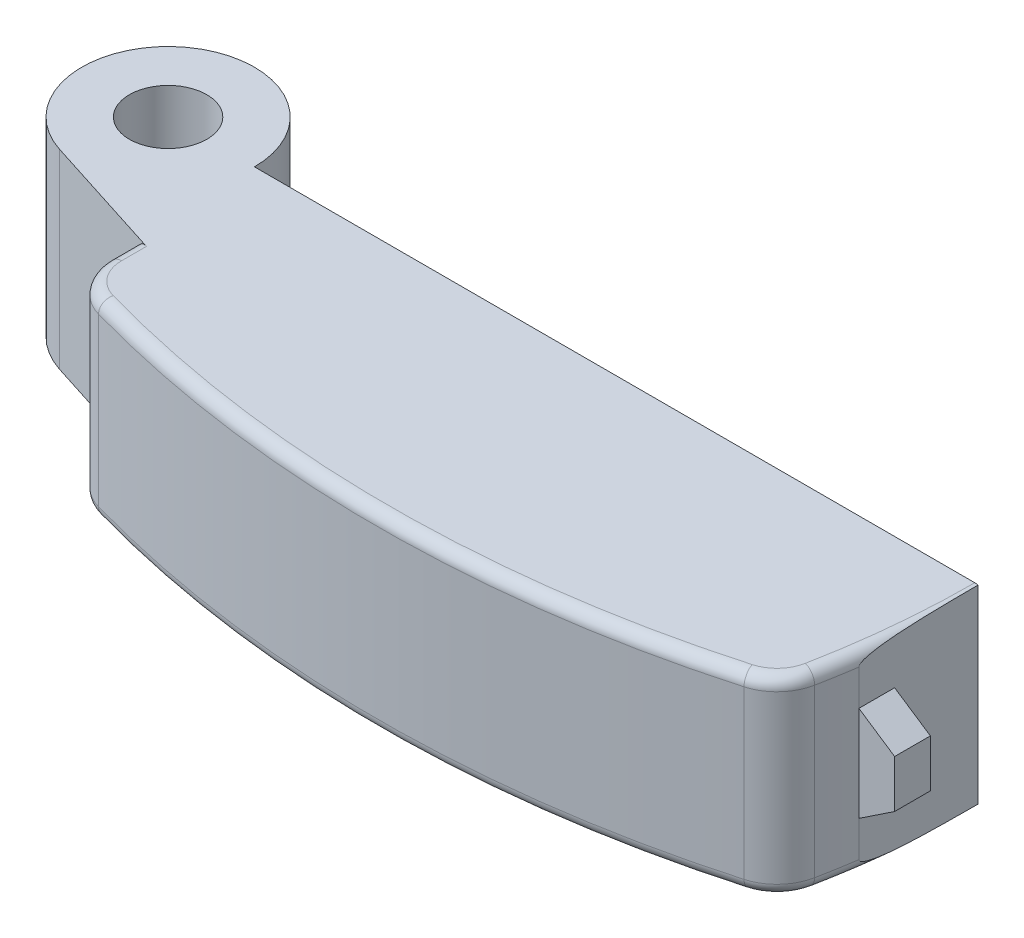
ISO-10303-21;
HEADER;
FILE_DESCRIPTION(('STEP AP214'),'2;1');
FILE_NAME('part.step','',(''),(''),'','','');
FILE_SCHEMA(('AUTOMOTIVE_DESIGN { 1 0 10303 214 1 1 1 1 }'));
ENDSEC;
DATA;
#1=APPLICATION_CONTEXT('core data for automotive mechanical design processes');
#2=APPLICATION_PROTOCOL_DEFINITION('international standard','automotive_design',2000,#1);
#3=PRODUCT_CONTEXT('',#1,'mechanical');
#4=PRODUCT('Part','Part','',(#3));
#5=PRODUCT_RELATED_PRODUCT_CATEGORY('part','',(#4));
#6=PRODUCT_DEFINITION_FORMATION('','',#4);
#7=PRODUCT_DEFINITION_CONTEXT('part definition',#1,'design');
#8=PRODUCT_DEFINITION('design','',#6,#7);
#9=PRODUCT_DEFINITION_SHAPE('','',#8);
#10=(LENGTH_UNIT() NAMED_UNIT(*) SI_UNIT(.MILLI.,.METRE.));
#11=(NAMED_UNIT(*) PLANE_ANGLE_UNIT() SI_UNIT($,.RADIAN.));
#12=(NAMED_UNIT(*) SI_UNIT($,.STERADIAN.) SOLID_ANGLE_UNIT());
#13=UNCERTAINTY_MEASURE_WITH_UNIT(LENGTH_MEASURE(1.E-05),#10,'distance_accuracy_value','');
#14=(GEOMETRIC_REPRESENTATION_CONTEXT(3) GLOBAL_UNCERTAINTY_ASSIGNED_CONTEXT((#13)) GLOBAL_UNIT_ASSIGNED_CONTEXT((#10,
#11,#12)) REPRESENTATION_CONTEXT('',''));
#15=CARTESIAN_POINT('',(0.,0.,0.));
#16=DIRECTION('',(0.,0.,1.));
#17=DIRECTION('',(1.,0.,0.));
#18=AXIS2_PLACEMENT_3D('',#15,#16,#17);
#19=CARTESIAN_POINT('',(34.,-4.,0.));
#20=DIRECTION('',(1.,0.,0.));
#21=DIRECTION('',(0.,0.,-1.));
#22=AXIS2_PLACEMENT_3D('',#19,#20,#21);
#23=PLANE('',#22);
#24=DIRECTION('',(0.,1.,0.));
#25=VECTOR('',#24,1.);
#26=CARTESIAN_POINT('',(34.,-4.,0.));
#27=LINE('',#26,#25);
#28=CARTESIAN_POINT('',(34.,-3.98162047990345,0.));
#29=VERTEX_POINT('',#28);
#30=CARTESIAN_POINT('',(34.,3.98162047990345,0.));
#31=VERTEX_POINT('',#30);
#32=EDGE_CURVE('E276',#29,#31,#27,.T.);
#33=ORIENTED_EDGE('',*,*,#32,.T.);
#34=CARTESIAN_POINT('',(34.,3.98162047990345,0.));
#35=CARTESIAN_POINT('',(34.,3.98159919285578,0.166663353283519));
#36=CARTESIAN_POINT('',(34.,3.9812782589749,0.333327294181278));
#37=CARTESIAN_POINT('',(34.,3.97988188118695,0.666662112135818));
#38=CARTESIAN_POINT('',(34.,3.97880639104146,0.833332988991726));
#39=CARTESIAN_POINT('',(34.,3.97524749303556,1.2209193138533));
#40=CARTESIAN_POINT('',(34.,3.97241974710555,1.44183183546992));
#41=CARTESIAN_POINT('',(34.,3.96436598597591,1.88361503266656));
#42=CARTESIAN_POINT('',(34.,3.95914001129464,2.1044857088905));
#43=CARTESIAN_POINT('',(34.,3.94722392938513,2.47360634591054));
#44=CARTESIAN_POINT('',(34.,3.9415779501098,2.62188919436799));
#45=CARTESIAN_POINT('',(34.,3.92790773499044,2.91834424872081));
#46=CARTESIAN_POINT('',(34.,3.91988361396798,3.06651645961182));
#47=CARTESIAN_POINT('',(34.,3.90361515757844,3.31437209200094));
#48=CARTESIAN_POINT('',(34.,3.89629540492433,3.41411552051021));
#49=CARTESIAN_POINT('',(34.,3.87964168815936,3.61343592334133));
#50=CARTESIAN_POINT('',(34.,3.87030779021255,3.71301290302272));
#51=CARTESIAN_POINT('',(34.,3.852359969864,3.87973069369845));
#52=CARTESIAN_POINT('',(34.,3.84448883990097,3.9469503175671));
#53=CARTESIAN_POINT('',(34.,3.82712410299428,4.08117783108778));
#54=CARTESIAN_POINT('',(34.,3.81763054000707,4.14818572642606));
#55=CARTESIAN_POINT('',(34.,3.79272184936317,4.30591743528455));
#56=CARTESIAN_POINT('',(34.,3.77640485055772,4.39650752111803));
#57=CARTESIAN_POINT('',(34.,3.74332824174571,4.54786051817009));
#58=CARTESIAN_POINT('',(34.,3.72834192907911,4.60899243665312));
#59=CARTESIAN_POINT('',(34.,3.69849031910501,4.7109467376168));
#60=CARTESIAN_POINT('',(34.,3.68503869387045,4.7521691463843));
#61=CARTESIAN_POINT('',(34.,3.65847672338858,4.82073701669557));
#62=CARTESIAN_POINT('',(34.,3.6465033543779,4.84849491212171));
#63=CARTESIAN_POINT('',(34.,3.62528803249557,4.88959316091038));
#64=CARTESIAN_POINT('',(34.,3.61738026572595,4.9036148604728));
#65=CARTESIAN_POINT('',(34.,3.60001706070478,4.93065693305494));
#66=CARTESIAN_POINT('',(34.,3.59056838390864,4.9436813308398));
#67=CARTESIAN_POINT('',(34.,3.57563952165258,4.96042341024651));
#68=CARTESIAN_POINT('',(34.,3.57117781540687,4.96503801058248));
#69=CARTESIAN_POINT('',(34.,3.56176479223758,4.97377095715126));
#70=CARTESIAN_POINT('',(34.,3.55681245000462,4.97788822248747));
#71=CARTESIAN_POINT('',(34.,3.54626129849113,4.98543771114093));
#72=CARTESIAN_POINT('',(34.,3.54065251481596,4.98885637176807));
#73=CARTESIAN_POINT('',(34.,3.528877015265,4.99449638178223));
#74=CARTESIAN_POINT('',(34.,3.522714712715,4.99672636377805));
#75=CARTESIAN_POINT('',(34.,3.51369951830024,4.9987596278393));
#76=CARTESIAN_POINT('',(34.,3.51098967279807,4.99922065264334));
#77=CARTESIAN_POINT('',(34.,3.50552098802409,4.9998424277503));
#78=CARTESIAN_POINT('',(34.,3.50276196205584,5.00000152519938));
#79=CARTESIAN_POINT('',(34.,3.50000000000018,5.0000000000008));
#80=B_SPLINE_CURVE_WITH_KNOTS('',3,(#34,#35,#36,#37,#38,#39,#40,#41,#42,#43,#44,#45,#46,#47,#48,
#49,#50,#51,#52,#53,#54,#55,#56,#57,#58,#59,#60,#61,#62,#63,#64,#65,#66,#67,#68,#69,#70,#71,#72,
#73,#74,#75,#76,#77,#78,#79),.UNSPECIFIED.,.F.,.F.,(4,2,2,2,2,2,2,2,2,2,2,2,2,2,2,2,2,2,2,2,2,2,
4),(0.,0.499990678696892,1.00001199897152,1.66279683154769,2.32557046670793,2.77072938462129,
3.2158668128472,3.51588769623864,3.81589872553636,4.01891875475482,4.22193328443876,
4.4979272478123,4.68660242743181,4.81656238283177,4.90705466279417,4.95530314075089,
5.00334533733403,5.02257492930979,5.04184558986957,5.06146076057049,5.08093146809262,
5.08916262656677,5.09743871668332),.UNSPECIFIED.);
#81=CARTESIAN_POINT('',(34.,3.5,5.));
#82=VERTEX_POINT('',#81);
#83=EDGE_CURVE('E337',#31,#82,#80,.T.);
#84=ORIENTED_EDGE('',*,*,#83,.T.);
#85=DIRECTION('',(0.,1.,0.));
#86=VECTOR('',#85,1.);
#87=CARTESIAN_POINT('',(34.,-4.,5.));
#88=LINE('',#87,#86);
#89=CARTESIAN_POINT('',(34.,2.,5.));
#90=VERTEX_POINT('',#89);
#91=EDGE_CURVE('E285',#90,#82,#88,.T.);
#92=ORIENTED_EDGE('',*,*,#91,.F.);
#93=DIRECTION('',(0.,0.,1.));
#94=VECTOR('',#93,1.);
#95=CARTESIAN_POINT('',(34.,2.,3.5));
#96=LINE('',#95,#94);
#97=CARTESIAN_POINT('',(34.,2.,3.5));
#98=VERTEX_POINT('',#97);
#99=EDGE_CURVE('E254',#98,#90,#96,.T.);
#100=ORIENTED_EDGE('',*,*,#99,.F.);
#101=DIRECTION('',(0.,-1.,0.));
#102=VECTOR('',#101,1.);
#103=CARTESIAN_POINT('',(34.,2.,3.5));
#104=LINE('',#103,#102);
#105=CARTESIAN_POINT('',(34.,-2.,3.5));
#106=VERTEX_POINT('',#105);
#107=EDGE_CURVE('E228',#98,#106,#104,.T.);
#108=ORIENTED_EDGE('',*,*,#107,.T.);
#109=DIRECTION('',(0.,0.,1.));
#110=VECTOR('',#109,1.);
#111=CARTESIAN_POINT('',(34.,-2.,3.5));
#112=LINE('',#111,#110);
#113=CARTESIAN_POINT('',(34.,-2.,5.));
#114=VERTEX_POINT('',#113);
#115=EDGE_CURVE('E241',#106,#114,#112,.T.);
#116=ORIENTED_EDGE('',*,*,#115,.T.);
#117=CARTESIAN_POINT('',(34.,-3.5,5.));
#118=VERTEX_POINT('',#117);
#119=EDGE_CURVE('E282',#118,#114,#88,.T.);
#120=ORIENTED_EDGE('',*,*,#119,.F.);
#121=CARTESIAN_POINT('',(34.,-3.5,5.));
#122=CARTESIAN_POINT('',(34.,-3.50462170859831,5.00001441578487));
#123=CARTESIAN_POINT('',(34.,-3.50922301130585,4.99956020687158));
#124=CARTESIAN_POINT('',(34.,-3.51821116965306,4.99785256927715));
#125=CARTESIAN_POINT('',(34.,-3.52260012514395,4.99661041346052));
#126=CARTESIAN_POINT('',(34.,-3.53238372731554,4.99299290089972));
#127=CARTESIAN_POINT('',(34.,-3.53769278067331,4.99039126685224));
#128=CARTESIAN_POINT('',(34.,-3.54785693125141,4.98438000424587));
#129=CARTESIAN_POINT('',(34.,-3.55270896754212,4.98096540303662));
#130=CARTESIAN_POINT('',(34.,-3.56569920393553,4.97061828430371));
#131=CARTESIAN_POINT('',(34.,-3.57333698742003,4.96306726385114));
#132=CARTESIAN_POINT('',(34.,-3.58752317700618,4.94702965383022));
#133=CARTESIAN_POINT('',(34.,-3.59406922645835,4.93854110445036));
#134=CARTESIAN_POINT('',(34.,-3.61030400808269,4.91540419858887));
#135=CARTESIAN_POINT('',(34.,-3.61932227716577,4.90029094106801));
#136=CARTESIAN_POINT('',(34.,-3.63599364258111,4.86931831460478));
#137=CARTESIAN_POINT('',(34.,-3.64364323179573,4.85345715687245));
#138=CARTESIAN_POINT('',(34.,-3.65800488289259,4.82120376344424));
#139=CARTESIAN_POINT('',(34.,-3.66471097925828,4.80480889084885));
#140=CARTESIAN_POINT('',(34.,-3.67736826020147,4.77175970887534));
#141=CARTESIAN_POINT('',(34.,-3.6833204123233,4.75510576344547));
#142=CARTESIAN_POINT('',(34.,-3.70214339592804,4.69946087457146));
#143=CARTESIAN_POINT('',(34.,-3.71375805855376,4.66004670133561));
#144=CARTESIAN_POINT('',(34.,-3.73502133605224,4.58068544266667));
#145=CARTESIAN_POINT('',(34.,-3.74466851399785,4.54073799028498));
#146=CARTESIAN_POINT('',(34.,-3.7715546716792,4.42024978207699));
#147=CARTESIAN_POINT('',(34.,-3.78668516945335,4.33924167886029));
#148=CARTESIAN_POINT('',(34.,-3.81359709252584,4.17653346358184));
#149=CARTESIAN_POINT('',(34.,-3.82537138752914,4.09483225240811));
#150=CARTESIAN_POINT('',(34.,-3.84650665474788,3.93124531059158));
#151=CARTESIAN_POINT('',(34.,-3.85587121287893,3.84936003918776));
#152=CARTESIAN_POINT('',(34.,-3.88087876741824,3.60786093452974));
#153=CARTESIAN_POINT('',(34.,-3.89408026755351,3.44799906108821));
#154=CARTESIAN_POINT('',(34.,-3.91632800111269,3.12797672361124));
#155=CARTESIAN_POINT('',(34.,-3.92537337180561,2.96781620450439));
#156=CARTESIAN_POINT('',(34.,-3.94061456564004,2.64711868932304));
#157=CARTESIAN_POINT('',(34.,-3.94680602895098,2.48658149133196));
#158=CARTESIAN_POINT('',(34.,-3.95717067630038,2.16545957623382));
#159=CARTESIAN_POINT('',(34.,-3.96134403688193,2.00487486451345));
#160=CARTESIAN_POINT('',(34.,-3.9680972943462,1.6904148039248));
#161=CARTESIAN_POINT('',(34.,-3.97073670889247,1.5365406825591));
#162=CARTESIAN_POINT('',(34.,-3.97503111362743,1.22877499554967));
#163=CARTESIAN_POINT('',(34.,-3.97668607619645,1.07488342953767));
#164=CARTESIAN_POINT('',(34.,-3.97924452328905,0.767490952157286));
#165=CARTESIAN_POINT('',(34.,-3.98014993324856,0.61399005598307));
#166=CARTESIAN_POINT('',(34.,-3.98132991318917,0.306992628334647));
#167=CARTESIAN_POINT('',(34.,-3.98160451138959,0.153496096972381));
#168=CARTESIAN_POINT('',(34.,-3.98162047990346,0.));
#169=B_SPLINE_CURVE_WITH_KNOTS('',3,(#121,#122,#123,#124,#125,#126,#127,#128,#129,#130,#131,
#132,#133,#134,#135,#136,#137,#138,#139,#140,#141,#142,#143,#144,#145,#146,#147,#148,#149,#150,
#151,#152,#153,#154,#155,#156,#157,#158,#159,#160,#161,#162,#163,#164,#165,#166,#167,#168),
.UNSPECIFIED.,.F.,.F.,(4,2,2,2,2,2,2,2,2,2,2,2,2,2,2,2,2,2,2,2,2,2,2,4),(0.,0.0138100444294082,
0.027426837314904,0.0450633627516521,0.0628106694330619,0.0948505858062899,0.126958793573787,
0.179619431310576,0.232413132693816,0.285526926882936,0.338571853740002,0.461743268273278,
0.58500431984306,0.832083700583452,1.07968415744165,1.32691400246769,1.80803205477512,
2.28924993268835,2.77120053627508,3.25310897132358,3.71479508684799,4.17649415477853,
4.63700350655861,5.09749225708178),.UNSPECIFIED.);
#170=EDGE_CURVE('E331',#118,#29,#169,.T.);
#171=ORIENTED_EDGE('',*,*,#170,.T.);
#172=EDGE_LOOP('',(#33,#84,#92,#100,#108,#116,#120,#171));
#173=FACE_BOUND('',#172,.T.);
#174=ADVANCED_FACE('F32',(#173),#23,.T.);
#175=CARTESIAN_POINT('',(0.,-4.,0.));
#176=DIRECTION('',(0.,1.,0.));
#177=DIRECTION('',(0.,0.,1.));
#178=AXIS2_PLACEMENT_3D('',#175,#176,#177);
#179=CYLINDRICAL_SURFACE('',#178,34.3656805548792);
#180=ORIENTED_EDGE('',*,*,#91,.T.);
#181=CARTESIAN_POINT('',(0.,3.5,0.));
#182=DIRECTION('',(0.,-1.,0.));
#183=DIRECTION('',(0.,0.,-1.));
#184=AXIS2_PLACEMENT_3D('',#181,#182,#183);
#185=CIRCLE('',#184,34.3656805548792);
#186=CARTESIAN_POINT('',(33.7284498627736,3.5,6.58723537262523));
#187=VERTEX_POINT('',#186);
#188=EDGE_CURVE('E437',#82,#187,#185,.T.);
#189=ORIENTED_EDGE('',*,*,#188,.T.);
#190=DIRECTION('',(0.,1.,0.));
#191=VECTOR('',#190,1.);
#192=CARTESIAN_POINT('',(33.7284498627736,-4.,6.58723537262523));
#193=LINE('',#192,#191);
#194=CARTESIAN_POINT('',(33.7284498627736,-3.5,6.58723537262523));
#195=VERTEX_POINT('',#194);
#196=EDGE_CURVE('E286',#195,#187,#193,.T.);
#197=ORIENTED_EDGE('',*,*,#196,.F.);
#198=CARTESIAN_POINT('',(0.,-3.5,0.));
#199=DIRECTION('',(0.,-1.,0.));
#200=DIRECTION('',(0.,0.,-1.));
#201=AXIS2_PLACEMENT_3D('',#198,#199,#200);
#202=CIRCLE('',#201,34.3656805548792);
#203=EDGE_CURVE('E438',#195,#118,#202,.F.);
#204=ORIENTED_EDGE('',*,*,#203,.T.);
#205=ORIENTED_EDGE('',*,*,#119,.T.);
#206=DIRECTION('',(0.,-1.,0.));
#207=VECTOR('',#206,1.);
#208=CARTESIAN_POINT('',(34.,2.,5.));
#209=LINE('',#208,#207);
#210=EDGE_CURVE('E242',#90,#114,#209,.T.);
#211=ORIENTED_EDGE('',*,*,#210,.F.);
#212=EDGE_LOOP('',(#180,#189,#197,#204,#205,#211));
#213=FACE_BOUND('',#212,.T.);
#214=ADVANCED_FACE('F347',(#213),#179,.T.);
#215=CARTESIAN_POINT('',(31.7655351572777,-4.,6.20387410834845));
#216=DIRECTION('',(0.,1.,0.));
#217=DIRECTION('',(0.,0.,1.));
#218=AXIS2_PLACEMENT_3D('',#215,#216,#217);
#219=CYLINDRICAL_SURFACE('',#218,2.);
#220=ORIENTED_EDGE('',*,*,#196,.T.);
#221=CARTESIAN_POINT('',(31.7655351572777,3.5,6.20387410834845));
#222=DIRECTION('',(0.,-1.,0.));
#223=DIRECTION('',(0.,0.,-1.));
#224=AXIS2_PLACEMENT_3D('',#221,#222,#223);
#225=CIRCLE('',#224,2.);
#226=CARTESIAN_POINT('',(32.3075254730544,3.5,8.12903552952963));
#227=VERTEX_POINT('',#226);
#228=EDGE_CURVE('E434',#187,#227,#225,.T.);
#229=ORIENTED_EDGE('',*,*,#228,.T.);
#230=DIRECTION('',(0.,1.,0.));
#231=VECTOR('',#230,1.);
#232=CARTESIAN_POINT('',(32.3075254730544,-4.,8.12903552952963));
#233=LINE('',#232,#231);
#234=CARTESIAN_POINT('',(32.3075254730544,-3.5,8.12903552952963));
#235=VERTEX_POINT('',#234);
#236=EDGE_CURVE('E289',#235,#227,#233,.T.);
#237=ORIENTED_EDGE('',*,*,#236,.F.);
#238=CARTESIAN_POINT('',(31.7655351572777,-3.5,6.20387410834845));
#239=DIRECTION('',(0.,-1.,0.));
#240=DIRECTION('',(0.,0.,-1.));
#241=AXIS2_PLACEMENT_3D('',#238,#239,#240);
#242=CIRCLE('',#241,2.);
#243=EDGE_CURVE('E396',#235,#195,#242,.F.);
#244=ORIENTED_EDGE('',*,*,#243,.T.);
#245=EDGE_LOOP('',(#220,#229,#237,#244));
#246=FACE_BOUND('',#245,.T.);
#247=ADVANCED_FACE('F458',(#246),#219,.T.);
#248=CARTESIAN_POINT('',(18.7577675786389,-4.,-40.));
#249=DIRECTION('',(0.,1.,0.));
#250=DIRECTION('',(0.,0.,1.));
#251=AXIS2_PLACEMENT_3D('',#248,#249,#250);
#252=CYLINDRICAL_SURFACE('',#251,50.);
#253=ORIENTED_EDGE('',*,*,#236,.T.);
#254=CARTESIAN_POINT('',(18.7577675786389,3.5,-40.));
#255=DIRECTION('',(0.,-1.,0.));
#256=DIRECTION('',(0.,0.,-1.));
#257=AXIS2_PLACEMENT_3D('',#254,#255,#256);
#258=CIRCLE('',#257,50.);
#259=CARTESIAN_POINT('',(5.20800968422338,3.5,8.12903552952963));
#260=VERTEX_POINT('',#259);
#261=EDGE_CURVE('E421',#227,#260,#258,.T.);
#262=ORIENTED_EDGE('',*,*,#261,.T.);
#263=DIRECTION('',(0.,1.,0.));
#264=VECTOR('',#263,1.);
#265=CARTESIAN_POINT('',(5.20800968422338,-4.,8.12903552952963));
#266=LINE('',#265,#264);
#267=CARTESIAN_POINT('',(5.20800968422338,-3.5,8.12903552952963));
#268=VERTEX_POINT('',#267);
#269=EDGE_CURVE('E292',#268,#260,#266,.T.);
#270=ORIENTED_EDGE('',*,*,#269,.F.);
#271=CARTESIAN_POINT('',(18.7577675786389,-3.5,-40.));
#272=DIRECTION('',(0.,-1.,0.));
#273=DIRECTION('',(0.,0.,-1.));
#274=AXIS2_PLACEMENT_3D('',#271,#272,#273);
#275=CIRCLE('',#274,50.);
#276=EDGE_CURVE('E423',#268,#235,#275,.F.);
#277=ORIENTED_EDGE('',*,*,#276,.T.);
#278=EDGE_LOOP('',(#253,#262,#270,#277));
#279=FACE_BOUND('',#278,.T.);
#280=ADVANCED_FACE('F460',(#279),#252,.T.);
#281=CARTESIAN_POINT('',(5.75,-4.,6.20387410834845));
#282=DIRECTION('',(0.,1.,0.));
#283=DIRECTION('',(0.,0.,1.));
#284=AXIS2_PLACEMENT_3D('',#281,#282,#283);
#285=CYLINDRICAL_SURFACE('',#284,2.);
#286=ORIENTED_EDGE('',*,*,#269,.T.);
#287=CARTESIAN_POINT('',(5.75,3.5,6.20387410834845));
#288=DIRECTION('',(0.,-1.,0.));
#289=DIRECTION('',(0.,0.,-1.));
#290=AXIS2_PLACEMENT_3D('',#287,#288,#289);
#291=CIRCLE('',#290,2.);
#292=CARTESIAN_POINT('',(3.75,3.5,6.20387410834845));
#293=VERTEX_POINT('',#292);
#294=EDGE_CURVE('E325',#260,#293,#291,.T.);
#295=ORIENTED_EDGE('',*,*,#294,.T.);
#296=DIRECTION('',(0.,1.,0.));
#297=VECTOR('',#296,1.);
#298=CARTESIAN_POINT('',(3.75,-4.,6.20387410834845));
#299=LINE('',#298,#297);
#300=CARTESIAN_POINT('',(3.75,-3.5,6.20387410834845));
#301=VERTEX_POINT('',#300);
#302=EDGE_CURVE('E295',#301,#293,#299,.T.);
#303=ORIENTED_EDGE('',*,*,#302,.F.);
#304=CARTESIAN_POINT('',(5.75,-3.5,6.20387410834845));
#305=DIRECTION('',(0.,-1.,0.));
#306=DIRECTION('',(0.,0.,-1.));
#307=AXIS2_PLACEMENT_3D('',#304,#305,#306);
#308=CIRCLE('',#307,2.);
#309=EDGE_CURVE('E323',#301,#268,#308,.F.);
#310=ORIENTED_EDGE('',*,*,#309,.T.);
#311=EDGE_LOOP('',(#286,#295,#303,#310));
#312=FACE_BOUND('',#311,.T.);
#313=ADVANCED_FACE('F543',(#312),#285,.T.);
#314=CARTESIAN_POINT('',(3.75,-4.,6.20387410834845));
#315=DIRECTION('',(-1.,0.,0.));
#316=DIRECTION('',(0.,0.,1.));
#317=AXIS2_PLACEMENT_3D('',#314,#315,#316);
#318=PLANE('',#317);
#319=ORIENTED_EDGE('',*,*,#302,.T.);
#320=DIRECTION('',(0.,0.,1.));
#321=VECTOR('',#320,1.);
#322=CARTESIAN_POINT('',(3.75,3.5,5.));
#323=LINE('',#322,#321);
#324=CARTESIAN_POINT('',(3.75,3.5,5.));
#325=VERTEX_POINT('',#324);
#326=EDGE_CURVE('E321',#293,#325,#323,.F.);
#327=ORIENTED_EDGE('',*,*,#326,.T.);
#328=DIRECTION('',(0.,1.,0.));
#329=VECTOR('',#328,1.);
#330=CARTESIAN_POINT('',(3.75,-4.,5.));
#331=LINE('',#330,#329);
#332=CARTESIAN_POINT('',(3.75,-3.5,5.));
#333=VERTEX_POINT('',#332);
#334=EDGE_CURVE('E298',#333,#325,#331,.T.);
#335=ORIENTED_EDGE('',*,*,#334,.F.);
#336=DIRECTION('',(0.,0.,1.));
#337=VECTOR('',#336,1.);
#338=CARTESIAN_POINT('',(3.75,-3.5,6.20387410834845));
#339=LINE('',#338,#337);
#340=EDGE_CURVE('E318',#333,#301,#339,.T.);
#341=ORIENTED_EDGE('',*,*,#340,.T.);
#342=EDGE_LOOP('',(#319,#327,#335,#341));
#343=FACE_BOUND('',#342,.T.);
#344=ADVANCED_FACE('F476',(#343),#318,.T.);
#345=CARTESIAN_POINT('',(-1.10088777511229,-4.,3.45379083133422));
#346=DIRECTION('',(-0.303693179341321,0.,0.952769884505991));
#347=DIRECTION('',(0.952769884505991,0.,0.303693179341321));
#348=AXIS2_PLACEMENT_3D('',#345,#346,#347);
#349=PLANE('',#348);
#350=DIRECTION('',(0.952769884505991,0.,0.303693179341321));
#351=VECTOR('',#350,1.);
#352=CARTESIAN_POINT('',(-1.10088777511229,4.,3.45379083133422));
#353=LINE('',#352,#351);
#354=CARTESIAN_POINT('',(-1.10088777511229,4.,3.45379083133422));
#355=VERTEX_POINT('',#354);
#356=CARTESIAN_POINT('',(4.25,4.,5.15937383426995));
#357=VERTEX_POINT('',#356);
#358=EDGE_CURVE('E272',#355,#357,#353,.T.);
#359=ORIENTED_EDGE('',*,*,#358,.F.);
#360=DIRECTION('',(0.,1.,0.));
#361=VECTOR('',#360,1.);
#362=CARTESIAN_POINT('',(-1.10088777511229,-4.,3.45379083133422));
#363=LINE('',#362,#361);
#364=CARTESIAN_POINT('',(-1.10088777511229,-4.,3.45379083133422));
#365=VERTEX_POINT('',#364);
#366=EDGE_CURVE('E301',#365,#355,#363,.T.);
#367=ORIENTED_EDGE('',*,*,#366,.F.);
#368=DIRECTION('',(0.952769884505991,0.,0.303693179341321));
#369=VECTOR('',#368,1.);
#370=CARTESIAN_POINT('',(-1.10088777511229,-4.,3.45379083133422));
#371=LINE('',#370,#369);
#372=CARTESIAN_POINT('',(4.25,-4.,5.15937383426995));
#373=VERTEX_POINT('',#372);
#374=EDGE_CURVE('E57',#365,#373,#371,.T.);
#375=ORIENTED_EDGE('',*,*,#374,.T.);
#376=CARTESIAN_POINT('',(4.25,-3.5,5.15937383426995));
#377=DIRECTION('',(-0.303693179341321,0.,0.952769884505991));
#378=DIRECTION('',(0.952769884505991,0.,0.303693179341321));
#379=AXIS2_PLACEMENT_3D('',#376,#377,#378);
#380=ELLIPSE('',#379,0.524785688686255,0.5);
#381=EDGE_CURVE('E11',#373,#333,#380,.F.);
#382=ORIENTED_EDGE('',*,*,#381,.T.);
#383=ORIENTED_EDGE('',*,*,#334,.T.);
#384=CARTESIAN_POINT('',(4.25,3.5,5.15937383426995));
#385=DIRECTION('',(-0.303693179341321,0.,0.952769884505991));
#386=DIRECTION('',(-0.952769884505991,0.,-0.303693179341321));
#387=AXIS2_PLACEMENT_3D('',#384,#385,#386);
#388=ELLIPSE('',#387,0.524785688686255,0.5);
#389=EDGE_CURVE('E42',#325,#357,#388,.F.);
#390=ORIENTED_EDGE('',*,*,#389,.T.);
#391=EDGE_LOOP('',(#359,#367,#375,#382,#383,#390));
#392=FACE_BOUND('',#391,.T.);
#393=ADVANCED_FACE('F473',(#392),#349,.T.);
#394=CARTESIAN_POINT('',(0.,-4.,0.));
#395=DIRECTION('',(0.,1.,0.));
#396=DIRECTION('',(0.,0.,1.));
#397=AXIS2_PLACEMENT_3D('',#394,#395,#396);
#398=CYLINDRICAL_SURFACE('',#397,3.625);
#399=CARTESIAN_POINT('',(0.,4.,0.));
#400=DIRECTION('',(0.,1.,0.));
#401=DIRECTION('',(0.,0.,1.));
#402=AXIS2_PLACEMENT_3D('',#399,#400,#401);
#403=CIRCLE('',#402,3.625);
#404=CARTESIAN_POINT('',(3.625,4.,0.));
#405=VERTEX_POINT('',#404);
#406=EDGE_CURVE('E278',#405,#355,#403,.T.);
#407=ORIENTED_EDGE('',*,*,#406,.F.);
#408=DIRECTION('',(0.,1.,0.));
#409=VECTOR('',#408,1.);
#410=CARTESIAN_POINT('',(3.625,-4.,0.));
#411=LINE('',#410,#409);
#412=CARTESIAN_POINT('',(3.625,-4.,0.));
#413=VERTEX_POINT('',#412);
#414=EDGE_CURVE('E303',#413,#405,#411,.T.);
#415=ORIENTED_EDGE('',*,*,#414,.F.);
#416=CARTESIAN_POINT('',(0.,-4.,0.));
#417=DIRECTION('',(0.,1.,0.));
#418=DIRECTION('',(0.,0.,1.));
#419=AXIS2_PLACEMENT_3D('',#416,#417,#418);
#420=CIRCLE('',#419,3.625);
#421=EDGE_CURVE('E271',#413,#365,#420,.T.);
#422=ORIENTED_EDGE('',*,*,#421,.T.);
#423=ORIENTED_EDGE('',*,*,#366,.T.);
#424=EDGE_LOOP('',(#407,#415,#422,#423));
#425=FACE_BOUND('',#424,.T.);
#426=ADVANCED_FACE('F493',(#425),#398,.T.);
#427=CARTESIAN_POINT('',(3.625,-4.,0.));
#428=DIRECTION('',(0.,0.,-1.));
#429=DIRECTION('',(-1.,0.,0.));
#430=AXIS2_PLACEMENT_3D('',#427,#428,#429);
#431=PLANE('',#430);
#432=DIRECTION('',(0.,1.,0.));
#433=VECTOR('',#432,1.);
#434=CARTESIAN_POINT('',(28.,2.5,0.));
#435=LINE('',#434,#433);
#436=CARTESIAN_POINT('',(28.,-2.5,0.));
#437=VERTEX_POINT('',#436);
#438=CARTESIAN_POINT('',(28.,2.5,0.));
#439=VERTEX_POINT('',#438);
#440=EDGE_CURVE('E50',#437,#439,#435,.T.);
#441=ORIENTED_EDGE('',*,*,#440,.F.);
#442=DIRECTION('',(-1.,0.,0.));
#443=VECTOR('',#442,1.);
#444=CARTESIAN_POINT('',(32.,-2.5,0.));
#445=LINE('',#444,#443);
#446=CARTESIAN_POINT('',(32.,-2.5,0.));
#447=VERTEX_POINT('',#446);
#448=EDGE_CURVE('E209',#447,#437,#445,.T.);
#449=ORIENTED_EDGE('',*,*,#448,.F.);
#450=DIRECTION('',(0.,-1.,0.));
#451=VECTOR('',#450,1.);
#452=CARTESIAN_POINT('',(32.,2.5,0.));
#453=LINE('',#452,#451);
#454=CARTESIAN_POINT('',(32.,2.5,0.));
#455=VERTEX_POINT('',#454);
#456=EDGE_CURVE('E212',#455,#447,#453,.T.);
#457=ORIENTED_EDGE('',*,*,#456,.F.);
#458=DIRECTION('',(1.,0.,0.));
#459=VECTOR('',#458,1.);
#460=CARTESIAN_POINT('',(32.,2.5,0.));
#461=LINE('',#460,#459);
#462=EDGE_CURVE('E218',#439,#455,#461,.T.);
#463=ORIENTED_EDGE('',*,*,#462,.F.);
#464=EDGE_LOOP('',(#441,#449,#457,#463));
#465=FACE_BOUND('',#464,.T.);
#466=DIRECTION('',(-1.,0.,0.));
#467=VECTOR('',#466,1.);
#468=CARTESIAN_POINT('',(3.625,4.,0.));
#469=LINE('',#468,#467);
#470=CARTESIAN_POINT('',(33.8656805548792,4.,0.));
#471=VERTEX_POINT('',#470);
#472=EDGE_CURVE('E266',#471,#405,#469,.T.);
#473=ORIENTED_EDGE('',*,*,#472,.F.);
#474=CARTESIAN_POINT('',(33.8656805548792,3.5,0.));
#475=DIRECTION('',(0.,0.,-1.));
#476=DIRECTION('',(-1.,0.,0.));
#477=AXIS2_PLACEMENT_3D('',#474,#475,#476);
#478=CIRCLE('',#477,0.5);
#479=EDGE_CURVE('E329',#471,#31,#478,.T.);
#480=ORIENTED_EDGE('',*,*,#479,.T.);
#481=ORIENTED_EDGE('',*,*,#32,.F.);
#482=CARTESIAN_POINT('',(33.8656805548792,-3.5,0.));
#483=DIRECTION('',(0.,0.,-1.));
#484=DIRECTION('',(-1.,0.,0.));
#485=AXIS2_PLACEMENT_3D('',#482,#483,#484);
#486=CIRCLE('',#485,0.5);
#487=CARTESIAN_POINT('',(33.8656805548792,-4.,0.));
#488=VERTEX_POINT('',#487);
#489=EDGE_CURVE('E327',#29,#488,#486,.T.);
#490=ORIENTED_EDGE('',*,*,#489,.T.);
#491=DIRECTION('',(-1.,0.,0.));
#492=VECTOR('',#491,1.);
#493=CARTESIAN_POINT('',(3.625,-4.,0.));
#494=LINE('',#493,#492);
#495=EDGE_CURVE('E269',#488,#413,#494,.T.);
#496=ORIENTED_EDGE('',*,*,#495,.T.);
#497=ORIENTED_EDGE('',*,*,#414,.T.);
#498=EDGE_LOOP('',(#473,#480,#481,#490,#496,#497));
#499=FACE_BOUND('',#498,.T.);
#500=ADVANCED_FACE('F349',(#465,#499),#431,.T.);
#501=CARTESIAN_POINT('',(0.,-4.,0.));
#502=DIRECTION('',(0.,-1.,0.));
#503=DIRECTION('',(0.,0.,-1.));
#504=AXIS2_PLACEMENT_3D('',#501,#502,#503);
#505=PLANE('',#504);
#506=CARTESIAN_POINT('',(0.,-4.,0.));
#507=DIRECTION('',(0.,1.,0.));
#508=DIRECTION('',(0.,0.,1.));
#509=AXIS2_PLACEMENT_3D('',#506,#507,#508);
#510=CIRCLE('',#509,1.625);
#511=CARTESIAN_POINT('',(0.,-4.,1.625));
#512=VERTEX_POINT('',#511);
#513=EDGE_CURVE('E263',#512,#512,#510,.T.);
#514=ORIENTED_EDGE('',*,*,#513,.T.);
#515=EDGE_LOOP('',(#514));
#516=FACE_BOUND('',#515,.T.);
#517=DIRECTION('',(0.,0.,1.));
#518=VECTOR('',#517,1.);
#519=CARTESIAN_POINT('',(4.25,-4.,0.));
#520=LINE('',#519,#518);
#521=CARTESIAN_POINT('',(4.25,-4.,6.20387410834845));
#522=VERTEX_POINT('',#521);
#523=EDGE_CURVE('E425',#522,#373,#520,.F.);
#524=ORIENTED_EDGE('',*,*,#523,.T.);
#525=ORIENTED_EDGE('',*,*,#374,.F.);
#526=ORIENTED_EDGE('',*,*,#421,.F.);
#527=ORIENTED_EDGE('',*,*,#495,.F.);
#528=CARTESIAN_POINT('',(0.,-4.,0.));
#529=DIRECTION('',(0.,-1.,0.));
#530=DIRECTION('',(0.,0.,-1.));
#531=AXIS2_PLACEMENT_3D('',#528,#529,#530);
#532=CIRCLE('',#531,33.8656805548792);
#533=CARTESIAN_POINT('',(33.2377211863997,-4.,6.49139505655603));
#534=VERTEX_POINT('',#533);
#535=EDGE_CURVE('E429',#488,#534,#532,.T.);
#536=ORIENTED_EDGE('',*,*,#535,.T.);
#537=CARTESIAN_POINT('',(31.7655351572777,-4.,6.20387410834845));
#538=DIRECTION('',(0.,-1.,0.));
#539=DIRECTION('',(0.,0.,-1.));
#540=AXIS2_PLACEMENT_3D('',#537,#538,#539);
#541=CIRCLE('',#540,1.5);
#542=CARTESIAN_POINT('',(32.1720278941102,-4.,7.64774517423433));
#543=VERTEX_POINT('',#542);
#544=EDGE_CURVE('E398',#534,#543,#541,.T.);
#545=ORIENTED_EDGE('',*,*,#544,.T.);
#546=CARTESIAN_POINT('',(18.7577675786389,-4.,-40.));
#547=DIRECTION('',(0.,-1.,0.));
#548=DIRECTION('',(0.,0.,-1.));
#549=AXIS2_PLACEMENT_3D('',#546,#547,#548);
#550=CIRCLE('',#549,49.5);
#551=CARTESIAN_POINT('',(5.34350726316753,-4.,7.64774517423434));
#552=VERTEX_POINT('',#551);
#553=EDGE_CURVE('E432',#543,#552,#550,.T.);
#554=ORIENTED_EDGE('',*,*,#553,.T.);
#555=CARTESIAN_POINT('',(5.75,-4.,6.20387410834845));
#556=DIRECTION('',(0.,-1.,0.));
#557=DIRECTION('',(0.,0.,-1.));
#558=AXIS2_PLACEMENT_3D('',#555,#556,#557);
#559=CIRCLE('',#558,1.5);
#560=EDGE_CURVE('E427',#552,#522,#559,.T.);
#561=ORIENTED_EDGE('',*,*,#560,.T.);
#562=EDGE_LOOP('',(#524,#525,#526,#527,#536,#545,#554,#561));
#563=FACE_BOUND('',#562,.T.);
#564=ADVANCED_FACE('F468',(#516,#563),#505,.T.);
#565=CARTESIAN_POINT('',(0.,4.,0.));
#566=DIRECTION('',(0.,-1.,0.));
#567=DIRECTION('',(0.,0.,-1.));
#568=AXIS2_PLACEMENT_3D('',#565,#566,#567);
#569=PLANE('',#568);
#570=ORIENTED_EDGE('',*,*,#358,.T.);
#571=DIRECTION('',(0.,0.,1.));
#572=VECTOR('',#571,1.);
#573=CARTESIAN_POINT('',(4.25,4.,6.20387410834845));
#574=LINE('',#573,#572);
#575=CARTESIAN_POINT('',(4.25,4.,6.20387410834845));
#576=VERTEX_POINT('',#575);
#577=EDGE_CURVE('E315',#357,#576,#574,.T.);
#578=ORIENTED_EDGE('',*,*,#577,.T.);
#579=CARTESIAN_POINT('',(5.75,4.,6.20387410834845));
#580=DIRECTION('',(0.,-1.,0.));
#581=DIRECTION('',(0.,0.,-1.));
#582=AXIS2_PLACEMENT_3D('',#579,#580,#581);
#583=CIRCLE('',#582,1.5);
#584=CARTESIAN_POINT('',(5.34350726316753,4.,7.64774517423434));
#585=VERTEX_POINT('',#584);
#586=EDGE_CURVE('E313',#576,#585,#583,.F.);
#587=ORIENTED_EDGE('',*,*,#586,.T.);
#588=CARTESIAN_POINT('',(18.7577675786389,4.,-40.));
#589=DIRECTION('',(0.,-1.,0.));
#590=DIRECTION('',(0.,0.,-1.));
#591=AXIS2_PLACEMENT_3D('',#588,#589,#590);
#592=CIRCLE('',#591,49.5);
#593=CARTESIAN_POINT('',(32.1720278941102,4.,7.64774517423433));
#594=VERTEX_POINT('',#593);
#595=EDGE_CURVE('E284',#585,#594,#592,.F.);
#596=ORIENTED_EDGE('',*,*,#595,.T.);
#597=CARTESIAN_POINT('',(31.7655351572777,4.,6.20387410834845));
#598=DIRECTION('',(0.,-1.,0.));
#599=DIRECTION('',(0.,0.,-1.));
#600=AXIS2_PLACEMENT_3D('',#597,#598,#599);
#601=CIRCLE('',#600,1.5);
#602=CARTESIAN_POINT('',(33.2377211863997,4.,6.49139505655603));
#603=VERTEX_POINT('',#602);
#604=EDGE_CURVE('E309',#594,#603,#601,.F.);
#605=ORIENTED_EDGE('',*,*,#604,.T.);
#606=CARTESIAN_POINT('',(0.,4.,0.));
#607=DIRECTION('',(0.,-1.,0.));
#608=DIRECTION('',(0.,0.,-1.));
#609=AXIS2_PLACEMENT_3D('',#606,#607,#608);
#610=CIRCLE('',#609,33.8656805548792);
#611=EDGE_CURVE('E311',#603,#471,#610,.F.);
#612=ORIENTED_EDGE('',*,*,#611,.T.);
#613=ORIENTED_EDGE('',*,*,#472,.T.);
#614=ORIENTED_EDGE('',*,*,#406,.T.);
#615=EDGE_LOOP('',(#570,#578,#587,#596,#605,#612,#613,#614));
#616=FACE_BOUND('',#615,.T.);
#617=CARTESIAN_POINT('',(0.,4.,0.));
#618=DIRECTION('',(0.,1.,0.));
#619=DIRECTION('',(0.,0.,1.));
#620=AXIS2_PLACEMENT_3D('',#617,#618,#619);
#621=CIRCLE('',#620,1.625);
#622=CARTESIAN_POINT('',(0.,4.,1.625));
#623=VERTEX_POINT('',#622);
#624=EDGE_CURVE('E256',#623,#623,#621,.T.);
#625=ORIENTED_EDGE('',*,*,#624,.F.);
#626=EDGE_LOOP('',(#625));
#627=FACE_BOUND('',#626,.T.);
#628=ADVANCED_FACE('F486',(#616,#627),#569,.F.);
#629=CARTESIAN_POINT('',(0.,-4.,0.));
#630=DIRECTION('',(0.,1.,0.));
#631=DIRECTION('',(0.,0.,1.));
#632=AXIS2_PLACEMENT_3D('',#629,#630,#631);
#633=CYLINDRICAL_SURFACE('',#632,1.625);
#634=ORIENTED_EDGE('',*,*,#513,.F.);
#635=EDGE_LOOP('',(#634));
#636=FACE_BOUND('',#635,.T.);
#637=ORIENTED_EDGE('',*,*,#624,.T.);
#638=EDGE_LOOP('',(#637));
#639=FACE_BOUND('',#638,.T.);
#640=ADVANCED_FACE('F526',(#636,#639),#633,.F.);
#641=CARTESIAN_POINT('',(35.5,0.999999999999999,3.5));
#642=DIRECTION('',(0.554700196225229,0.832050294337843,0.));
#643=DIRECTION('',(-0.832050294337844,0.554700196225229,0.));
#644=AXIS2_PLACEMENT_3D('',#641,#642,#643);
#645=PLANE('',#644);
#646=DIRECTION('',(-0.832050294337844,0.554700196225229,0.));
#647=VECTOR('',#646,1.);
#648=CARTESIAN_POINT('',(35.5,0.999999999999999,5.));
#649=LINE('',#648,#647);
#650=CARTESIAN_POINT('',(35.5,0.999999999999999,5.));
#651=VERTEX_POINT('',#650);
#652=EDGE_CURVE('E232',#651,#90,#649,.T.);
#653=ORIENTED_EDGE('',*,*,#652,.F.);
#654=DIRECTION('',(0.,0.,1.));
#655=VECTOR('',#654,1.);
#656=CARTESIAN_POINT('',(35.5,0.999999999999999,3.5));
#657=LINE('',#656,#655);
#658=CARTESIAN_POINT('',(35.5,0.999999999999999,3.5));
#659=VERTEX_POINT('',#658);
#660=EDGE_CURVE('E257',#659,#651,#657,.T.);
#661=ORIENTED_EDGE('',*,*,#660,.F.);
#662=DIRECTION('',(-0.832050294337844,0.554700196225229,0.));
#663=VECTOR('',#662,1.);
#664=CARTESIAN_POINT('',(35.5,0.999999999999999,3.5));
#665=LINE('',#664,#663);
#666=EDGE_CURVE('E238',#659,#98,#665,.T.);
#667=ORIENTED_EDGE('',*,*,#666,.T.);
#668=ORIENTED_EDGE('',*,*,#99,.T.);
#669=EDGE_LOOP('',(#653,#661,#667,#668));
#670=FACE_BOUND('',#669,.T.);
#671=ADVANCED_FACE('F509',(#670),#645,.T.);
#672=CARTESIAN_POINT('',(35.5,-1.,3.5));
#673=DIRECTION('',(1.,0.,0.));
#674=DIRECTION('',(0.,0.,-1.));
#675=AXIS2_PLACEMENT_3D('',#672,#673,#674);
#676=PLANE('',#675);
#677=DIRECTION('',(0.,1.,0.));
#678=VECTOR('',#677,1.);
#679=CARTESIAN_POINT('',(35.5,-1.,5.));
#680=LINE('',#679,#678);
#681=CARTESIAN_POINT('',(35.5,-1.,5.));
#682=VERTEX_POINT('',#681);
#683=EDGE_CURVE('E249',#682,#651,#680,.T.);
#684=ORIENTED_EDGE('',*,*,#683,.F.);
#685=DIRECTION('',(0.,0.,1.));
#686=VECTOR('',#685,1.);
#687=CARTESIAN_POINT('',(35.5,-1.,3.5));
#688=LINE('',#687,#686);
#689=CARTESIAN_POINT('',(35.5,-1.,3.5));
#690=VERTEX_POINT('',#689);
#691=EDGE_CURVE('E259',#690,#682,#688,.T.);
#692=ORIENTED_EDGE('',*,*,#691,.F.);
#693=DIRECTION('',(0.,1.,0.));
#694=VECTOR('',#693,1.);
#695=CARTESIAN_POINT('',(35.5,-1.,3.5));
#696=LINE('',#695,#694);
#697=EDGE_CURVE('E235',#690,#659,#696,.T.);
#698=ORIENTED_EDGE('',*,*,#697,.T.);
#699=ORIENTED_EDGE('',*,*,#660,.T.);
#700=EDGE_LOOP('',(#684,#692,#698,#699));
#701=FACE_BOUND('',#700,.T.);
#702=ADVANCED_FACE('F507',(#701),#676,.T.);
#703=CARTESIAN_POINT('',(34.,-2.,3.5));
#704=DIRECTION('',(0.554700196225228,-0.832050294337844,0.));
#705=DIRECTION('',(0.832050294337844,0.554700196225228,0.));
#706=AXIS2_PLACEMENT_3D('',#703,#704,#705);
#707=PLANE('',#706);
#708=DIRECTION('',(0.832050294337844,0.554700196225228,0.));
#709=VECTOR('',#708,1.);
#710=CARTESIAN_POINT('',(34.,-2.,5.));
#711=LINE('',#710,#709);
#712=EDGE_CURVE('E245',#114,#682,#711,.T.);
#713=ORIENTED_EDGE('',*,*,#712,.F.);
#714=ORIENTED_EDGE('',*,*,#115,.F.);
#715=DIRECTION('',(0.832050294337844,0.554700196225228,0.));
#716=VECTOR('',#715,1.);
#717=CARTESIAN_POINT('',(34.,-2.,3.5));
#718=LINE('',#717,#716);
#719=EDGE_CURVE('E231',#106,#690,#718,.T.);
#720=ORIENTED_EDGE('',*,*,#719,.T.);
#721=ORIENTED_EDGE('',*,*,#691,.T.);
#722=EDGE_LOOP('',(#713,#714,#720,#721));
#723=FACE_BOUND('',#722,.T.);
#724=ADVANCED_FACE('F502',(#723),#707,.T.);
#725=CARTESIAN_POINT('',(0.,0.,3.5));
#726=DIRECTION('',(0.,0.,1.));
#727=DIRECTION('',(1.,0.,0.));
#728=AXIS2_PLACEMENT_3D('',#725,#726,#727);
#729=PLANE('',#728);
#730=ORIENTED_EDGE('',*,*,#107,.F.);
#731=ORIENTED_EDGE('',*,*,#666,.F.);
#732=ORIENTED_EDGE('',*,*,#697,.F.);
#733=ORIENTED_EDGE('',*,*,#719,.F.);
#734=EDGE_LOOP('',(#730,#731,#732,#733));
#735=FACE_BOUND('',#734,.T.);
#736=ADVANCED_FACE('F512',(#735),#729,.F.);
#737=CARTESIAN_POINT('',(0.,0.,5.));
#738=DIRECTION('',(0.,0.,1.));
#739=DIRECTION('',(1.,0.,0.));
#740=AXIS2_PLACEMENT_3D('',#737,#738,#739);
#741=PLANE('',#740);
#742=ORIENTED_EDGE('',*,*,#210,.T.);
#743=ORIENTED_EDGE('',*,*,#712,.T.);
#744=ORIENTED_EDGE('',*,*,#683,.T.);
#745=ORIENTED_EDGE('',*,*,#652,.T.);
#746=EDGE_LOOP('',(#742,#743,#744,#745));
#747=FACE_BOUND('',#746,.T.);
#748=ADVANCED_FACE('F371',(#747),#741,.T.);
#749=CARTESIAN_POINT('',(0.,3.5,0.));
#750=DIRECTION('',(0.,-1.,0.));
#751=DIRECTION('',(0.,0.,-1.));
#752=AXIS2_PLACEMENT_3D('',#749,#750,#751);
#753=TOROIDAL_SURFACE('',#752,33.8656805548792,0.5);
#754=ORIENTED_EDGE('',*,*,#479,.F.);
#755=ORIENTED_EDGE('',*,*,#611,.F.);
#756=CARTESIAN_POINT('',(33.2377211863997,3.5,6.49139505655603));
#757=DIRECTION('',(-0.191680632138389,0.,0.981457352747957));
#758=DIRECTION('',(0.981457352747957,0.,0.191680632138389));
#759=AXIS2_PLACEMENT_3D('',#756,#757,#758);
#760=CIRCLE('',#759,0.5);
#761=EDGE_CURVE('E246',#187,#603,#760,.T.);
#762=ORIENTED_EDGE('',*,*,#761,.F.);
#763=ORIENTED_EDGE('',*,*,#188,.F.);
#764=ORIENTED_EDGE('',*,*,#83,.F.);
#765=EDGE_LOOP('',(#754,#755,#762,#763,#764));
#766=FACE_BOUND('',#765,.T.);
#767=ADVANCED_FACE('F366',(#766),#753,.T.);
#768=CARTESIAN_POINT('',(31.7655351572777,3.5,6.20387410834845));
#769=DIRECTION('',(0.,-1.,0.));
#770=DIRECTION('',(0.,0.,-1.));
#771=AXIS2_PLACEMENT_3D('',#768,#769,#770);
#772=TOROIDAL_SURFACE('',#771,1.5,0.5);
#773=ORIENTED_EDGE('',*,*,#761,.T.);
#774=ORIENTED_EDGE('',*,*,#604,.F.);
#775=CARTESIAN_POINT('',(32.1720278941102,3.5,7.64774517423433));
#776=DIRECTION('',(-0.962580710590589,0.,0.270995157888323));
#777=DIRECTION('',(0.270995157888323,0.,0.962580710590589));
#778=AXIS2_PLACEMENT_3D('',#775,#776,#777);
#779=CIRCLE('',#778,0.5);
#780=EDGE_CURVE('E414',#227,#594,#779,.T.);
#781=ORIENTED_EDGE('',*,*,#780,.F.);
#782=ORIENTED_EDGE('',*,*,#228,.F.);
#783=EDGE_LOOP('',(#773,#774,#781,#782));
#784=FACE_BOUND('',#783,.T.);
#785=ADVANCED_FACE('F363',(#784),#772,.T.);
#786=CARTESIAN_POINT('',(18.7577675786389,3.5,-40.));
#787=DIRECTION('',(0.,-1.,0.));
#788=DIRECTION('',(0.,0.,-1.));
#789=AXIS2_PLACEMENT_3D('',#786,#787,#788);
#790=TOROIDAL_SURFACE('',#789,49.5,0.5);
#791=ORIENTED_EDGE('',*,*,#780,.T.);
#792=ORIENTED_EDGE('',*,*,#595,.F.);
#793=CARTESIAN_POINT('',(5.34350726316753,3.5,7.64774517423433));
#794=DIRECTION('',(-0.962580710590592,0.,-0.27099515788831));
#795=DIRECTION('',(-0.27099515788831,0.,0.962580710590593));
#796=AXIS2_PLACEMENT_3D('',#793,#794,#795);
#797=CIRCLE('',#796,0.5);
#798=EDGE_CURVE('E403',#260,#585,#797,.T.);
#799=ORIENTED_EDGE('',*,*,#798,.F.);
#800=ORIENTED_EDGE('',*,*,#261,.F.);
#801=EDGE_LOOP('',(#791,#792,#799,#800));
#802=FACE_BOUND('',#801,.T.);
#803=ADVANCED_FACE('F359',(#802),#790,.T.);
#804=CARTESIAN_POINT('',(5.75,3.5,6.20387410834845));
#805=DIRECTION('',(0.,-1.,0.));
#806=DIRECTION('',(0.,0.,-1.));
#807=AXIS2_PLACEMENT_3D('',#804,#805,#806);
#808=TOROIDAL_SURFACE('',#807,1.5,0.5);
#809=ORIENTED_EDGE('',*,*,#798,.T.);
#810=ORIENTED_EDGE('',*,*,#586,.F.);
#811=CARTESIAN_POINT('',(4.25,3.5,6.20387410834845));
#812=DIRECTION('',(0.,0.,-1.));
#813=DIRECTION('',(-1.,0.,0.));
#814=AXIS2_PLACEMENT_3D('',#811,#812,#813);
#815=CIRCLE('',#814,0.5);
#816=EDGE_CURVE('E401',#293,#576,#815,.T.);
#817=ORIENTED_EDGE('',*,*,#816,.F.);
#818=ORIENTED_EDGE('',*,*,#294,.F.);
#819=EDGE_LOOP('',(#809,#810,#817,#818));
#820=FACE_BOUND('',#819,.T.);
#821=ADVANCED_FACE('F355',(#820),#808,.T.);
#822=CARTESIAN_POINT('',(4.25,3.5,0.));
#823=DIRECTION('',(0.,0.,-1.));
#824=DIRECTION('',(-1.,0.,0.));
#825=AXIS2_PLACEMENT_3D('',#822,#823,#824);
#826=CYLINDRICAL_SURFACE('',#825,0.5);
#827=ORIENTED_EDGE('',*,*,#389,.F.);
#828=ORIENTED_EDGE('',*,*,#326,.F.);
#829=ORIENTED_EDGE('',*,*,#816,.T.);
#830=ORIENTED_EDGE('',*,*,#577,.F.);
#831=EDGE_LOOP('',(#827,#828,#829,#830));
#832=FACE_BOUND('',#831,.T.);
#833=ADVANCED_FACE('F351',(#832),#826,.T.);
#834=CARTESIAN_POINT('',(0.,-3.5,0.));
#835=DIRECTION('',(0.,-1.,0.));
#836=DIRECTION('',(0.,0.,-1.));
#837=AXIS2_PLACEMENT_3D('',#834,#835,#836);
#838=TOROIDAL_SURFACE('',#837,33.8656805548792,0.5);
#839=ORIENTED_EDGE('',*,*,#170,.F.);
#840=ORIENTED_EDGE('',*,*,#203,.F.);
#841=CARTESIAN_POINT('',(33.2377211863997,-3.5,6.49139505655603));
#842=DIRECTION('',(-0.191680632138389,0.,0.981457352747957));
#843=DIRECTION('',(0.981457352747957,0.,0.191680632138389));
#844=AXIS2_PLACEMENT_3D('',#841,#842,#843);
#845=CIRCLE('',#844,0.5);
#846=EDGE_CURVE('E37',#534,#195,#845,.T.);
#847=ORIENTED_EDGE('',*,*,#846,.F.);
#848=ORIENTED_EDGE('',*,*,#535,.F.);
#849=ORIENTED_EDGE('',*,*,#489,.F.);
#850=EDGE_LOOP('',(#839,#840,#847,#848,#849));
#851=FACE_BOUND('',#850,.T.);
#852=ADVANCED_FACE('F34',(#851),#838,.T.);
#853=CARTESIAN_POINT('',(31.7655351572777,-3.5,6.20387410834845));
#854=DIRECTION('',(0.,-1.,0.));
#855=DIRECTION('',(0.,0.,-1.));
#856=AXIS2_PLACEMENT_3D('',#853,#854,#855);
#857=TOROIDAL_SURFACE('',#856,1.5,0.5);
#858=ORIENTED_EDGE('',*,*,#846,.T.);
#859=ORIENTED_EDGE('',*,*,#243,.F.);
#860=CARTESIAN_POINT('',(32.1720278941102,-3.5,7.64774517423433));
#861=DIRECTION('',(-0.962580710590589,0.,0.270995157888323));
#862=DIRECTION('',(0.270995157888323,0.,0.962580710590589));
#863=AXIS2_PLACEMENT_3D('',#860,#861,#862);
#864=CIRCLE('',#863,0.5);
#865=EDGE_CURVE('E402',#543,#235,#864,.T.);
#866=ORIENTED_EDGE('',*,*,#865,.F.);
#867=ORIENTED_EDGE('',*,*,#544,.F.);
#868=EDGE_LOOP('',(#858,#859,#866,#867));
#869=FACE_BOUND('',#868,.T.);
#870=ADVANCED_FACE('F383',(#869),#857,.T.);
#871=CARTESIAN_POINT('',(18.7577675786389,-3.5,-40.));
#872=DIRECTION('',(0.,-1.,0.));
#873=DIRECTION('',(0.,0.,-1.));
#874=AXIS2_PLACEMENT_3D('',#871,#872,#873);
#875=TOROIDAL_SURFACE('',#874,49.5,0.5);
#876=ORIENTED_EDGE('',*,*,#865,.T.);
#877=ORIENTED_EDGE('',*,*,#276,.F.);
#878=CARTESIAN_POINT('',(5.34350726316753,-3.5,7.64774517423434));
#879=DIRECTION('',(-0.962580710590592,0.,-0.27099515788831));
#880=DIRECTION('',(-0.27099515788831,0.,0.962580710590592));
#881=AXIS2_PLACEMENT_3D('',#878,#879,#880);
#882=CIRCLE('',#881,0.5);
#883=EDGE_CURVE('E405',#552,#268,#882,.T.);
#884=ORIENTED_EDGE('',*,*,#883,.F.);
#885=ORIENTED_EDGE('',*,*,#553,.F.);
#886=EDGE_LOOP('',(#876,#877,#884,#885));
#887=FACE_BOUND('',#886,.T.);
#888=ADVANCED_FACE('F380',(#887),#875,.T.);
#889=CARTESIAN_POINT('',(5.75,-3.5,6.20387410834845));
#890=DIRECTION('',(0.,-1.,0.));
#891=DIRECTION('',(0.,0.,-1.));
#892=AXIS2_PLACEMENT_3D('',#889,#890,#891);
#893=TOROIDAL_SURFACE('',#892,1.5,0.5);
#894=ORIENTED_EDGE('',*,*,#883,.T.);
#895=ORIENTED_EDGE('',*,*,#309,.F.);
#896=CARTESIAN_POINT('',(4.25,-3.5,6.20387410834845));
#897=DIRECTION('',(0.,0.,-1.));
#898=DIRECTION('',(-1.,0.,0.));
#899=AXIS2_PLACEMENT_3D('',#896,#897,#898);
#900=CIRCLE('',#899,0.5);
#901=EDGE_CURVE('E224',#522,#301,#900,.T.);
#902=ORIENTED_EDGE('',*,*,#901,.F.);
#903=ORIENTED_EDGE('',*,*,#560,.F.);
#904=EDGE_LOOP('',(#894,#895,#902,#903));
#905=FACE_BOUND('',#904,.T.);
#906=ADVANCED_FACE('F376',(#905),#893,.T.);
#907=CARTESIAN_POINT('',(4.25,-3.5,6.20387410834845));
#908=DIRECTION('',(0.,0.,1.));
#909=DIRECTION('',(1.,0.,0.));
#910=AXIS2_PLACEMENT_3D('',#907,#908,#909);
#911=CYLINDRICAL_SURFACE('',#910,0.5);
#912=ORIENTED_EDGE('',*,*,#381,.F.);
#913=ORIENTED_EDGE('',*,*,#523,.F.);
#914=ORIENTED_EDGE('',*,*,#901,.T.);
#915=ORIENTED_EDGE('',*,*,#340,.F.);
#916=EDGE_LOOP('',(#912,#913,#914,#915));
#917=FACE_BOUND('',#916,.T.);
#918=ADVANCED_FACE('F373',(#917),#911,.T.);
#919=CARTESIAN_POINT('',(28.,2.5,4.));
#920=DIRECTION('',(-1.,0.,0.));
#921=DIRECTION('',(0.,0.,1.));
#922=AXIS2_PLACEMENT_3D('',#919,#920,#921);
#923=PLANE('',#922);
#924=ORIENTED_EDGE('',*,*,#440,.T.);
#925=DIRECTION('',(0.,0.,-1.));
#926=VECTOR('',#925,1.);
#927=CARTESIAN_POINT('',(28.,2.5,4.));
#928=LINE('',#927,#926);
#929=CARTESIAN_POINT('',(28.,2.5,4.));
#930=VERTEX_POINT('',#929);
#931=EDGE_CURVE('E187',#930,#439,#928,.T.);
#932=ORIENTED_EDGE('',*,*,#931,.F.);
#933=DIRECTION('',(0.,1.,0.));
#934=VECTOR('',#933,1.);
#935=CARTESIAN_POINT('',(28.,2.5,4.));
#936=LINE('',#935,#934);
#937=CARTESIAN_POINT('',(28.,-2.5,4.));
#938=VERTEX_POINT('',#937);
#939=EDGE_CURVE('E191',#938,#930,#936,.T.);
#940=ORIENTED_EDGE('',*,*,#939,.F.);
#941=DIRECTION('',(0.,0.,-1.));
#942=VECTOR('',#941,1.);
#943=CARTESIAN_POINT('',(28.,-2.5,4.));
#944=LINE('',#943,#942);
#945=EDGE_CURVE('E222',#938,#437,#944,.T.);
#946=ORIENTED_EDGE('',*,*,#945,.T.);
#947=EDGE_LOOP('',(#924,#932,#940,#946));
#948=FACE_BOUND('',#947,.T.);
#949=ADVANCED_FACE('F189',(#948),#923,.F.);
#950=CARTESIAN_POINT('',(32.,-2.5,4.));
#951=DIRECTION('',(0.,-1.,0.));
#952=DIRECTION('',(0.,0.,-1.));
#953=AXIS2_PLACEMENT_3D('',#950,#951,#952);
#954=PLANE('',#953);
#955=ORIENTED_EDGE('',*,*,#448,.T.);
#956=ORIENTED_EDGE('',*,*,#945,.F.);
#957=DIRECTION('',(-1.,0.,0.));
#958=VECTOR('',#957,1.);
#959=CARTESIAN_POINT('',(32.,-2.5,4.));
#960=LINE('',#959,#958);
#961=CARTESIAN_POINT('',(32.,-2.5,4.));
#962=VERTEX_POINT('',#961);
#963=EDGE_CURVE('E197',#962,#938,#960,.T.);
#964=ORIENTED_EDGE('',*,*,#963,.F.);
#965=DIRECTION('',(0.,0.,-1.));
#966=VECTOR('',#965,1.);
#967=CARTESIAN_POINT('',(32.,-2.5,4.));
#968=LINE('',#967,#966);
#969=EDGE_CURVE('E225',#962,#447,#968,.T.);
#970=ORIENTED_EDGE('',*,*,#969,.T.);
#971=EDGE_LOOP('',(#955,#956,#964,#970));
#972=FACE_BOUND('',#971,.T.);
#973=ADVANCED_FACE('F564',(#972),#954,.F.);
#974=CARTESIAN_POINT('',(32.,2.5,4.));
#975=DIRECTION('',(1.,0.,0.));
#976=DIRECTION('',(0.,0.,-1.));
#977=AXIS2_PLACEMENT_3D('',#974,#975,#976);
#978=PLANE('',#977);
#979=ORIENTED_EDGE('',*,*,#456,.T.);
#980=ORIENTED_EDGE('',*,*,#969,.F.);
#981=DIRECTION('',(0.,-1.,0.));
#982=VECTOR('',#981,1.);
#983=CARTESIAN_POINT('',(32.,2.5,4.));
#984=LINE('',#983,#982);
#985=CARTESIAN_POINT('',(32.,2.5,4.));
#986=VERTEX_POINT('',#985);
#987=EDGE_CURVE('E205',#986,#962,#984,.T.);
#988=ORIENTED_EDGE('',*,*,#987,.F.);
#989=DIRECTION('',(0.,0.,-1.));
#990=VECTOR('',#989,1.);
#991=CARTESIAN_POINT('',(32.,2.5,4.));
#992=LINE('',#991,#990);
#993=EDGE_CURVE('E196',#986,#455,#992,.T.);
#994=ORIENTED_EDGE('',*,*,#993,.T.);
#995=EDGE_LOOP('',(#979,#980,#988,#994));
#996=FACE_BOUND('',#995,.T.);
#997=ADVANCED_FACE('F562',(#996),#978,.F.);
#998=CARTESIAN_POINT('',(32.,2.5,4.));
#999=DIRECTION('',(0.,1.,0.));
#1000=DIRECTION('',(-1.,0.,0.));
#1001=AXIS2_PLACEMENT_3D('',#998,#999,#1000);
#1002=PLANE('',#1001);
#1003=ORIENTED_EDGE('',*,*,#462,.T.);
#1004=ORIENTED_EDGE('',*,*,#993,.F.);
#1005=DIRECTION('',(1.,0.,0.));
#1006=VECTOR('',#1005,1.);
#1007=CARTESIAN_POINT('',(32.,2.5,4.));
#1008=LINE('',#1007,#1006);
#1009=EDGE_CURVE('E200',#930,#986,#1008,.T.);
#1010=ORIENTED_EDGE('',*,*,#1009,.F.);
#1011=ORIENTED_EDGE('',*,*,#931,.T.);
#1012=EDGE_LOOP('',(#1003,#1004,#1010,#1011));
#1013=FACE_BOUND('',#1012,.T.);
#1014=ADVANCED_FACE('F201',(#1013),#1002,.F.);
#1015=CARTESIAN_POINT('',(0.,0.,4.));
#1016=DIRECTION('',(0.,0.,-1.));
#1017=DIRECTION('',(-1.,0.,0.));
#1018=AXIS2_PLACEMENT_3D('',#1015,#1016,#1017);
#1019=PLANE('',#1018);
#1020=ORIENTED_EDGE('',*,*,#939,.T.);
#1021=ORIENTED_EDGE('',*,*,#1009,.T.);
#1022=ORIENTED_EDGE('',*,*,#987,.T.);
#1023=ORIENTED_EDGE('',*,*,#963,.T.);
#1024=EDGE_LOOP('',(#1020,#1021,#1022,#1023));
#1025=FACE_BOUND('',#1024,.T.);
#1026=ADVANCED_FACE('F207',(#1025),#1019,.T.);
#1027=CLOSED_SHELL('',(#174,#214,#247,#280,#313,#344,#393,#426,#500,#564,#628,#640,#671,#702,
#724,#736,#748,#767,#785,#803,#821,#833,#852,#870,#888,#906,#918,#949,#973,#997,#1014,#1026));
#1028=MANIFOLD_SOLID_BREP('B2',#1027);
#1029=ADVANCED_BREP_SHAPE_REPRESENTATION('',(#18,#1028),#14);
#1030=SHAPE_DEFINITION_REPRESENTATION(#9,#1029);
ENDSEC;
END-ISO-10303-21;
